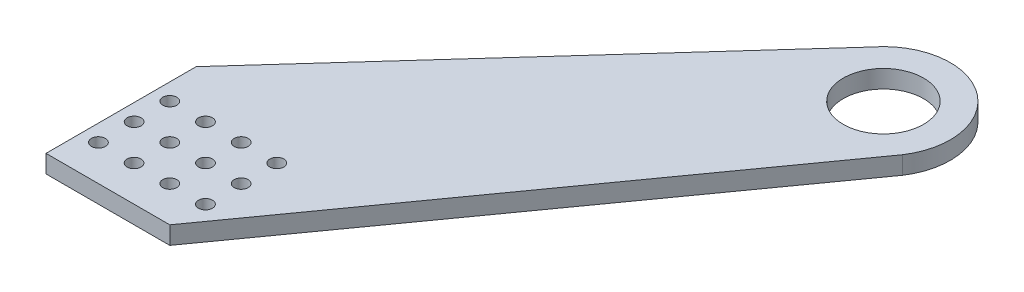
ISO-10303-21;
HEADER;
FILE_DESCRIPTION(('STEP AP214'),'2;1');
FILE_NAME('part.step','',(''),(''),'','','');
FILE_SCHEMA(('AUTOMOTIVE_DESIGN { 1 0 10303 214 1 1 1 1 }'));
ENDSEC;
DATA;
#1=APPLICATION_CONTEXT('core data for automotive mechanical design processes');
#2=APPLICATION_PROTOCOL_DEFINITION('international standard','automotive_design',2000,#1);
#3=PRODUCT_CONTEXT('',#1,'mechanical');
#4=PRODUCT('Part','Part','',(#3));
#5=PRODUCT_RELATED_PRODUCT_CATEGORY('part','',(#4));
#6=PRODUCT_DEFINITION_FORMATION('','',#4);
#7=PRODUCT_DEFINITION_CONTEXT('part definition',#1,'design');
#8=PRODUCT_DEFINITION('design','',#6,#7);
#9=PRODUCT_DEFINITION_SHAPE('','',#8);
#10=(LENGTH_UNIT() NAMED_UNIT(*) SI_UNIT(.MILLI.,.METRE.));
#11=(NAMED_UNIT(*) PLANE_ANGLE_UNIT() SI_UNIT($,.RADIAN.));
#12=(NAMED_UNIT(*) SI_UNIT($,.STERADIAN.) SOLID_ANGLE_UNIT());
#13=UNCERTAINTY_MEASURE_WITH_UNIT(LENGTH_MEASURE(1.E-05),#10,'distance_accuracy_value','');
#14=(GEOMETRIC_REPRESENTATION_CONTEXT(3) GLOBAL_UNCERTAINTY_ASSIGNED_CONTEXT((#13)) GLOBAL_UNIT_ASSIGNED_CONTEXT((#10,
#11,#12)) REPRESENTATION_CONTEXT('',''));
#15=CARTESIAN_POINT('',(0.,0.,0.));
#16=DIRECTION('',(0.,0.,1.));
#17=DIRECTION('',(1.,0.,0.));
#18=AXIS2_PLACEMENT_3D('',#15,#16,#17);
#19=CARTESIAN_POINT('',(-51.2601360500161,6.35,-36.6866869012752));
#20=DIRECTION('',(-0.813190602315479,0.,-0.581997460738265));
#21=DIRECTION('',(-0.581997460738265,0.,0.813190602315479));
#22=AXIS2_PLACEMENT_3D('',#19,#20,#21);
#23=PLANE('',#22);
#24=DIRECTION('',(0.581997460738265,0.,-0.813190602315479));
#25=VECTOR('',#24,1.);
#26=CARTESIAN_POINT('',(-51.2601360500161,0.,-36.6866869012752));
#27=LINE('',#26,#25);
#28=CARTESIAN_POINT('',(590.55,0.,-933.45));
#29=VERTEX_POINT('',#28);
#30=CARTESIAN_POINT('',(699.329134459148,0.,-1085.4406457289));
#31=VERTEX_POINT('',#30);
#32=EDGE_CURVE('E150',#29,#31,#27,.T.);
#33=ORIENTED_EDGE('',*,*,#32,.T.);
#34=DIRECTION('',(0.,-1.,0.));
#35=VECTOR('',#34,1.);
#36=CARTESIAN_POINT('',(699.329134459148,6.35,-1085.4406457289));
#37=LINE('',#36,#35);
#38=CARTESIAN_POINT('',(699.329134459148,6.35,-1085.4406457289));
#39=VERTEX_POINT('',#38);
#40=EDGE_CURVE('E11',#39,#31,#37,.T.);
#41=ORIENTED_EDGE('',*,*,#40,.F.);
#42=DIRECTION('',(0.581997460738265,0.,-0.813190602315479));
#43=VECTOR('',#42,1.);
#44=CARTESIAN_POINT('',(-51.2601360500161,6.35,-36.6866869012752));
#45=LINE('',#44,#43);
#46=CARTESIAN_POINT('',(590.55,6.35,-933.45));
#47=VERTEX_POINT('',#46);
#48=EDGE_CURVE('E105',#47,#39,#45,.T.);
#49=ORIENTED_EDGE('',*,*,#48,.F.);
#50=DIRECTION('',(0.,-1.,0.));
#51=VECTOR('',#50,1.);
#52=CARTESIAN_POINT('',(590.55,6.35,-933.45));
#53=LINE('',#52,#51);
#54=EDGE_CURVE('E110',#47,#29,#53,.T.);
#55=ORIENTED_EDGE('',*,*,#54,.T.);
#56=EDGE_LOOP('',(#33,#41,#49,#55));
#57=FACE_BOUND('',#56,.T.);
#58=ADVANCED_FACE('F35',(#57),#23,.F.);
#59=CARTESIAN_POINT('',(679.45,6.35,-1098.55));
#60=DIRECTION('',(0.,-1.,0.));
#61=DIRECTION('',(0.,0.,-1.));
#62=AXIS2_PLACEMENT_3D('',#59,#60,#61);
#63=CYLINDRICAL_SURFACE('',#62,23.8125);
#64=CARTESIAN_POINT('',(679.45,0.,-1098.55));
#65=DIRECTION('',(0.,1.,0.));
#66=DIRECTION('',(0.,0.,1.));
#67=AXIS2_PLACEMENT_3D('',#64,#65,#66);
#68=CIRCLE('',#67,23.8125);
#69=CARTESIAN_POINT('',(660.629172145986,0.,-1113.1380634472));
#70=VERTEX_POINT('',#69);
#71=EDGE_CURVE('E153',#31,#70,#68,.T.);
#72=ORIENTED_EDGE('',*,*,#71,.T.);
#73=DIRECTION('',(0.,-1.,0.));
#74=VECTOR('',#73,1.);
#75=CARTESIAN_POINT('',(660.629172145986,6.35,-1113.1380634472));
#76=LINE('',#75,#74);
#77=CARTESIAN_POINT('',(660.629172145986,6.35,-1113.1380634472));
#78=VERTEX_POINT('',#77);
#79=EDGE_CURVE('E44',#78,#70,#76,.T.);
#80=ORIENTED_EDGE('',*,*,#79,.F.);
#81=CARTESIAN_POINT('',(679.45,6.35,-1098.55));
#82=DIRECTION('',(0.,1.,0.));
#83=DIRECTION('',(0.,0.,1.));
#84=AXIS2_PLACEMENT_3D('',#81,#82,#83);
#85=CIRCLE('',#84,23.8125);
#86=EDGE_CURVE('E85',#39,#78,#85,.T.);
#87=ORIENTED_EDGE('',*,*,#86,.F.);
#88=ORIENTED_EDGE('',*,*,#40,.T.);
#89=EDGE_LOOP('',(#72,#80,#87,#88));
#90=FACE_BOUND('',#89,.T.);
#91=ADVANCED_FACE('F161',(#90),#63,.T.);
#92=CARTESIAN_POINT('',(-190.254107287016,6.35,-172.010780817744));
#93=DIRECTION('',(-0.741776037995552,0.,-0.670647679080172));
#94=DIRECTION('',(-0.670647679080172,0.,0.741776037995552));
#95=AXIS2_PLACEMENT_3D('',#92,#93,#94);
#96=PLANE('',#95);
#97=DIRECTION('',(0.670647679080172,0.,-0.741776037995552));
#98=VECTOR('',#97,1.);
#99=CARTESIAN_POINT('',(-190.254107287016,0.,-172.010780817744));
#100=LINE('',#99,#98);
#101=CARTESIAN_POINT('',(546.490533987518,0.,-986.893972195713));
#102=VERTEX_POINT('',#101);
#103=EDGE_CURVE('E97',#102,#70,#100,.T.);
#104=ORIENTED_EDGE('',*,*,#103,.F.);
#105=DIRECTION('',(0.,-1.,0.));
#106=VECTOR('',#105,1.);
#107=CARTESIAN_POINT('',(546.490533987518,6.35,-986.893972195713));
#108=LINE('',#107,#106);
#109=CARTESIAN_POINT('',(546.490533987518,6.35,-986.893972195713));
#110=VERTEX_POINT('',#109);
#111=EDGE_CURVE('E91',#110,#102,#108,.T.);
#112=ORIENTED_EDGE('',*,*,#111,.F.);
#113=DIRECTION('',(0.670647679080172,0.,-0.741776037995552));
#114=VECTOR('',#113,1.);
#115=CARTESIAN_POINT('',(-190.254107287016,6.35,-172.010780817744));
#116=LINE('',#115,#114);
#117=EDGE_CURVE('E95',#110,#78,#116,.T.);
#118=ORIENTED_EDGE('',*,*,#117,.T.);
#119=ORIENTED_EDGE('',*,*,#79,.T.);
#120=EDGE_LOOP('',(#104,#112,#118,#119));
#121=FACE_BOUND('',#120,.T.);
#122=ADVANCED_FACE('F93',(#121),#96,.T.);
#123=CARTESIAN_POINT('',(546.49053398752,6.35,-1.13525688425777E-12));
#124=DIRECTION('',(1.,0.,0.));
#125=DIRECTION('',(0.,0.,-1.));
#126=AXIS2_PLACEMENT_3D('',#123,#124,#125);
#127=PLANE('',#126);
#128=DIRECTION('',(0.,0.,1.));
#129=VECTOR('',#128,1.);
#130=CARTESIAN_POINT('',(546.49053398752,0.,-1.13525688425777E-12));
#131=LINE('',#130,#129);
#132=CARTESIAN_POINT('',(546.490533987518,0.,-933.45));
#133=VERTEX_POINT('',#132);
#134=EDGE_CURVE('E71',#102,#133,#131,.T.);
#135=ORIENTED_EDGE('',*,*,#134,.T.);
#136=DIRECTION('',(0.,-1.,0.));
#137=VECTOR('',#136,1.);
#138=CARTESIAN_POINT('',(546.490533987518,6.35,-933.45));
#139=LINE('',#138,#137);
#140=CARTESIAN_POINT('',(546.490533987518,6.35,-933.45));
#141=VERTEX_POINT('',#140);
#142=EDGE_CURVE('E98',#141,#133,#139,.T.);
#143=ORIENTED_EDGE('',*,*,#142,.F.);
#144=DIRECTION('',(0.,0.,1.));
#145=VECTOR('',#144,1.);
#146=CARTESIAN_POINT('',(546.49053398752,6.35,-1.13525688425777E-12));
#147=LINE('',#146,#145);
#148=EDGE_CURVE('E100',#110,#141,#147,.T.);
#149=ORIENTED_EDGE('',*,*,#148,.F.);
#150=ORIENTED_EDGE('',*,*,#111,.T.);
#151=EDGE_LOOP('',(#135,#143,#149,#150));
#152=FACE_BOUND('',#151,.T.);
#153=ADVANCED_FACE('F101',(#152),#127,.F.);
#154=CARTESIAN_POINT('',(679.45,6.35,-1098.55));
#155=DIRECTION('',(0.,-1.,0.));
#156=DIRECTION('',(0.,0.,-1.));
#157=AXIS2_PLACEMENT_3D('',#154,#155,#156);
#158=CYLINDRICAL_SURFACE('',#157,14.2875);
#159=CARTESIAN_POINT('',(679.45,6.35,-1098.55));
#160=DIRECTION('',(0.,1.,0.));
#161=DIRECTION('',(0.,0.,1.));
#162=AXIS2_PLACEMENT_3D('',#159,#160,#161);
#163=CIRCLE('',#162,14.2875);
#164=CARTESIAN_POINT('',(679.45,6.35,-1084.2625));
#165=VERTEX_POINT('',#164);
#166=EDGE_CURVE('E430',#165,#165,#163,.T.);
#167=ORIENTED_EDGE('',*,*,#166,.T.);
#168=EDGE_LOOP('',(#167));
#169=FACE_BOUND('',#168,.T.);
#170=CARTESIAN_POINT('',(679.45,0.,-1098.55));
#171=DIRECTION('',(0.,1.,0.));
#172=DIRECTION('',(0.,0.,1.));
#173=AXIS2_PLACEMENT_3D('',#170,#171,#172);
#174=CIRCLE('',#173,14.2875);
#175=CARTESIAN_POINT('',(679.45,0.,-1084.2625));
#176=VERTEX_POINT('',#175);
#177=EDGE_CURVE('E147',#176,#176,#174,.T.);
#178=ORIENTED_EDGE('',*,*,#177,.F.);
#179=EDGE_LOOP('',(#178));
#180=FACE_BOUND('',#179,.T.);
#181=ADVANCED_FACE('F189',(#169,#180),#158,.F.);
#182=CARTESIAN_POINT('',(590.55,6.35,-971.55));
#183=DIRECTION('',(0.,-1.,0.));
#184=DIRECTION('',(0.,0.,-1.));
#185=AXIS2_PLACEMENT_3D('',#182,#183,#184);
#186=CYLINDRICAL_SURFACE('',#185,2.48919999999994);
#187=CARTESIAN_POINT('',(590.55,6.35,-971.55));
#188=DIRECTION('',(0.,1.,0.));
#189=DIRECTION('',(0.,0.,1.));
#190=AXIS2_PLACEMENT_3D('',#187,#188,#189);
#191=CIRCLE('',#190,2.48919999999994);
#192=CARTESIAN_POINT('',(590.55,6.35,-969.0608));
#193=VERTEX_POINT('',#192);
#194=EDGE_CURVE('E427',#193,#193,#191,.T.);
#195=ORIENTED_EDGE('',*,*,#194,.T.);
#196=EDGE_LOOP('',(#195));
#197=FACE_BOUND('',#196,.T.);
#198=CARTESIAN_POINT('',(590.55,0.,-971.55));
#199=DIRECTION('',(0.,1.,0.));
#200=DIRECTION('',(0.,0.,1.));
#201=AXIS2_PLACEMENT_3D('',#198,#199,#200);
#202=CIRCLE('',#201,2.48919999999994);
#203=CARTESIAN_POINT('',(590.55,0.,-969.0608));
#204=VERTEX_POINT('',#203);
#205=EDGE_CURVE('E144',#204,#204,#202,.T.);
#206=ORIENTED_EDGE('',*,*,#205,.F.);
#207=EDGE_LOOP('',(#206));
#208=FACE_BOUND('',#207,.T.);
#209=ADVANCED_FACE('F192',(#197,#208),#186,.F.);
#210=CARTESIAN_POINT('',(577.85,6.35,-971.55));
#211=DIRECTION('',(0.,-1.,0.));
#212=DIRECTION('',(0.,0.,-1.));
#213=AXIS2_PLACEMENT_3D('',#210,#211,#212);
#214=CYLINDRICAL_SURFACE('',#213,2.48919999999994);
#215=CARTESIAN_POINT('',(577.85,6.35,-971.55));
#216=DIRECTION('',(0.,1.,0.));
#217=DIRECTION('',(0.,0.,1.));
#218=AXIS2_PLACEMENT_3D('',#215,#216,#217);
#219=CIRCLE('',#218,2.48919999999994);
#220=CARTESIAN_POINT('',(577.85,6.35,-969.0608));
#221=VERTEX_POINT('',#220);
#222=EDGE_CURVE('E424',#221,#221,#219,.T.);
#223=ORIENTED_EDGE('',*,*,#222,.T.);
#224=EDGE_LOOP('',(#223));
#225=FACE_BOUND('',#224,.T.);
#226=CARTESIAN_POINT('',(577.85,0.,-971.55));
#227=DIRECTION('',(0.,1.,0.));
#228=DIRECTION('',(0.,0.,1.));
#229=AXIS2_PLACEMENT_3D('',#226,#227,#228);
#230=CIRCLE('',#229,2.48919999999994);
#231=CARTESIAN_POINT('',(577.85,0.,-969.0608));
#232=VERTEX_POINT('',#231);
#233=EDGE_CURVE('E141',#232,#232,#230,.T.);
#234=ORIENTED_EDGE('',*,*,#233,.F.);
#235=EDGE_LOOP('',(#234));
#236=FACE_BOUND('',#235,.T.);
#237=ADVANCED_FACE('F196',(#225,#236),#214,.F.);
#238=CARTESIAN_POINT('',(577.85,6.35,-958.85));
#239=DIRECTION('',(0.,-1.,0.));
#240=DIRECTION('',(0.,0.,-1.));
#241=AXIS2_PLACEMENT_3D('',#238,#239,#240);
#242=CYLINDRICAL_SURFACE('',#241,2.48919999999994);
#243=CARTESIAN_POINT('',(577.85,6.35,-958.85));
#244=DIRECTION('',(0.,1.,0.));
#245=DIRECTION('',(0.,0.,1.));
#246=AXIS2_PLACEMENT_3D('',#243,#244,#245);
#247=CIRCLE('',#246,2.48919999999994);
#248=CARTESIAN_POINT('',(577.85,6.35,-956.3608));
#249=VERTEX_POINT('',#248);
#250=EDGE_CURVE('E421',#249,#249,#247,.T.);
#251=ORIENTED_EDGE('',*,*,#250,.T.);
#252=EDGE_LOOP('',(#251));
#253=FACE_BOUND('',#252,.T.);
#254=CARTESIAN_POINT('',(577.85,0.,-958.85));
#255=DIRECTION('',(0.,1.,0.));
#256=DIRECTION('',(0.,0.,1.));
#257=AXIS2_PLACEMENT_3D('',#254,#255,#256);
#258=CIRCLE('',#257,2.48919999999994);
#259=CARTESIAN_POINT('',(577.85,0.,-956.3608));
#260=VERTEX_POINT('',#259);
#261=EDGE_CURVE('E138',#260,#260,#258,.T.);
#262=ORIENTED_EDGE('',*,*,#261,.F.);
#263=EDGE_LOOP('',(#262));
#264=FACE_BOUND('',#263,.T.);
#265=ADVANCED_FACE('F200',(#253,#264),#242,.F.);
#266=CARTESIAN_POINT('',(590.55,6.35,-958.85));
#267=DIRECTION('',(0.,-1.,0.));
#268=DIRECTION('',(0.,0.,-1.));
#269=AXIS2_PLACEMENT_3D('',#266,#267,#268);
#270=CYLINDRICAL_SURFACE('',#269,2.48919999999994);
#271=CARTESIAN_POINT('',(590.55,6.35,-958.85));
#272=DIRECTION('',(0.,1.,0.));
#273=DIRECTION('',(0.,0.,1.));
#274=AXIS2_PLACEMENT_3D('',#271,#272,#273);
#275=CIRCLE('',#274,2.48919999999994);
#276=CARTESIAN_POINT('',(590.55,6.35,-956.3608));
#277=VERTEX_POINT('',#276);
#278=EDGE_CURVE('E418',#277,#277,#275,.T.);
#279=ORIENTED_EDGE('',*,*,#278,.T.);
#280=EDGE_LOOP('',(#279));
#281=FACE_BOUND('',#280,.T.);
#282=CARTESIAN_POINT('',(590.55,0.,-958.85));
#283=DIRECTION('',(0.,1.,0.));
#284=DIRECTION('',(0.,0.,1.));
#285=AXIS2_PLACEMENT_3D('',#282,#283,#284);
#286=CIRCLE('',#285,2.48919999999994);
#287=CARTESIAN_POINT('',(590.55,0.,-956.3608));
#288=VERTEX_POINT('',#287);
#289=EDGE_CURVE('E135',#288,#288,#286,.T.);
#290=ORIENTED_EDGE('',*,*,#289,.F.);
#291=EDGE_LOOP('',(#290));
#292=FACE_BOUND('',#291,.T.);
#293=ADVANCED_FACE('F204',(#281,#292),#270,.F.);
#294=CARTESIAN_POINT('',(590.55,6.35,-946.15));
#295=DIRECTION('',(0.,-1.,0.));
#296=DIRECTION('',(0.,0.,-1.));
#297=AXIS2_PLACEMENT_3D('',#294,#295,#296);
#298=CYLINDRICAL_SURFACE('',#297,2.48919999999994);
#299=CARTESIAN_POINT('',(590.55,6.35,-946.15));
#300=DIRECTION('',(0.,1.,0.));
#301=DIRECTION('',(0.,0.,1.));
#302=AXIS2_PLACEMENT_3D('',#299,#300,#301);
#303=CIRCLE('',#302,2.48919999999994);
#304=CARTESIAN_POINT('',(590.55,6.35,-943.6608));
#305=VERTEX_POINT('',#304);
#306=EDGE_CURVE('E415',#305,#305,#303,.T.);
#307=ORIENTED_EDGE('',*,*,#306,.T.);
#308=EDGE_LOOP('',(#307));
#309=FACE_BOUND('',#308,.T.);
#310=CARTESIAN_POINT('',(590.55,0.,-946.15));
#311=DIRECTION('',(0.,1.,0.));
#312=DIRECTION('',(0.,0.,1.));
#313=AXIS2_PLACEMENT_3D('',#310,#311,#312);
#314=CIRCLE('',#313,2.48919999999994);
#315=CARTESIAN_POINT('',(590.55,0.,-943.6608));
#316=VERTEX_POINT('',#315);
#317=EDGE_CURVE('E132',#316,#316,#314,.T.);
#318=ORIENTED_EDGE('',*,*,#317,.F.);
#319=EDGE_LOOP('',(#318));
#320=FACE_BOUND('',#319,.T.);
#321=ADVANCED_FACE('F208',(#309,#320),#298,.F.);
#322=CARTESIAN_POINT('',(577.85,6.35,-946.15));
#323=DIRECTION('',(0.,-1.,0.));
#324=DIRECTION('',(0.,0.,-1.));
#325=AXIS2_PLACEMENT_3D('',#322,#323,#324);
#326=CYLINDRICAL_SURFACE('',#325,2.48919999999994);
#327=CARTESIAN_POINT('',(577.85,6.35,-946.15));
#328=DIRECTION('',(0.,1.,0.));
#329=DIRECTION('',(0.,0.,1.));
#330=AXIS2_PLACEMENT_3D('',#327,#328,#329);
#331=CIRCLE('',#330,2.48919999999994);
#332=CARTESIAN_POINT('',(577.85,6.35,-943.6608));
#333=VERTEX_POINT('',#332);
#334=EDGE_CURVE('E412',#333,#333,#331,.T.);
#335=ORIENTED_EDGE('',*,*,#334,.T.);
#336=EDGE_LOOP('',(#335));
#337=FACE_BOUND('',#336,.T.);
#338=CARTESIAN_POINT('',(577.85,0.,-946.15));
#339=DIRECTION('',(0.,1.,0.));
#340=DIRECTION('',(0.,0.,1.));
#341=AXIS2_PLACEMENT_3D('',#338,#339,#340);
#342=CIRCLE('',#341,2.48919999999994);
#343=CARTESIAN_POINT('',(577.85,0.,-943.6608));
#344=VERTEX_POINT('',#343);
#345=EDGE_CURVE('E129',#344,#344,#342,.T.);
#346=ORIENTED_EDGE('',*,*,#345,.F.);
#347=EDGE_LOOP('',(#346));
#348=FACE_BOUND('',#347,.T.);
#349=ADVANCED_FACE('F212',(#337,#348),#326,.F.);
#350=CARTESIAN_POINT('',(565.15,6.35,-946.15));
#351=DIRECTION('',(0.,-1.,0.));
#352=DIRECTION('',(0.,0.,-1.));
#353=AXIS2_PLACEMENT_3D('',#350,#351,#352);
#354=CYLINDRICAL_SURFACE('',#353,2.48919999999994);
#355=CARTESIAN_POINT('',(565.15,6.35,-946.15));
#356=DIRECTION('',(0.,1.,0.));
#357=DIRECTION('',(0.,0.,1.));
#358=AXIS2_PLACEMENT_3D('',#355,#356,#357);
#359=CIRCLE('',#358,2.48919999999994);
#360=CARTESIAN_POINT('',(565.15,6.35,-943.6608));
#361=VERTEX_POINT('',#360);
#362=EDGE_CURVE('E409',#361,#361,#359,.T.);
#363=ORIENTED_EDGE('',*,*,#362,.T.);
#364=EDGE_LOOP('',(#363));
#365=FACE_BOUND('',#364,.T.);
#366=CARTESIAN_POINT('',(565.15,0.,-946.15));
#367=DIRECTION('',(0.,1.,0.));
#368=DIRECTION('',(0.,0.,1.));
#369=AXIS2_PLACEMENT_3D('',#366,#367,#368);
#370=CIRCLE('',#369,2.48919999999994);
#371=CARTESIAN_POINT('',(565.15,0.,-943.6608));
#372=VERTEX_POINT('',#371);
#373=EDGE_CURVE('E126',#372,#372,#370,.T.);
#374=ORIENTED_EDGE('',*,*,#373,.F.);
#375=EDGE_LOOP('',(#374));
#376=FACE_BOUND('',#375,.T.);
#377=ADVANCED_FACE('F216',(#365,#376),#354,.F.);
#378=CARTESIAN_POINT('',(565.15,6.35,-958.85));
#379=DIRECTION('',(0.,-1.,0.));
#380=DIRECTION('',(0.,0.,-1.));
#381=AXIS2_PLACEMENT_3D('',#378,#379,#380);
#382=CYLINDRICAL_SURFACE('',#381,2.48919999999994);
#383=CARTESIAN_POINT('',(565.15,6.35,-958.85));
#384=DIRECTION('',(0.,1.,0.));
#385=DIRECTION('',(0.,0.,1.));
#386=AXIS2_PLACEMENT_3D('',#383,#384,#385);
#387=CIRCLE('',#386,2.48919999999994);
#388=CARTESIAN_POINT('',(565.15,6.35,-956.3608));
#389=VERTEX_POINT('',#388);
#390=EDGE_CURVE('E406',#389,#389,#387,.T.);
#391=ORIENTED_EDGE('',*,*,#390,.T.);
#392=EDGE_LOOP('',(#391));
#393=FACE_BOUND('',#392,.T.);
#394=CARTESIAN_POINT('',(565.15,0.,-958.85));
#395=DIRECTION('',(0.,1.,0.));
#396=DIRECTION('',(0.,0.,1.));
#397=AXIS2_PLACEMENT_3D('',#394,#395,#396);
#398=CIRCLE('',#397,2.48919999999994);
#399=CARTESIAN_POINT('',(565.15,0.,-956.3608));
#400=VERTEX_POINT('',#399);
#401=EDGE_CURVE('E123',#400,#400,#398,.T.);
#402=ORIENTED_EDGE('',*,*,#401,.F.);
#403=EDGE_LOOP('',(#402));
#404=FACE_BOUND('',#403,.T.);
#405=ADVANCED_FACE('F220',(#393,#404),#382,.F.);
#406=CARTESIAN_POINT('',(565.15,6.35,-971.55));
#407=DIRECTION('',(0.,-1.,0.));
#408=DIRECTION('',(0.,0.,-1.));
#409=AXIS2_PLACEMENT_3D('',#406,#407,#408);
#410=CYLINDRICAL_SURFACE('',#409,2.48919999999994);
#411=CARTESIAN_POINT('',(565.15,6.35,-971.55));
#412=DIRECTION('',(0.,1.,0.));
#413=DIRECTION('',(0.,0.,1.));
#414=AXIS2_PLACEMENT_3D('',#411,#412,#413);
#415=CIRCLE('',#414,2.48919999999994);
#416=CARTESIAN_POINT('',(565.15,6.35,-969.0608));
#417=VERTEX_POINT('',#416);
#418=EDGE_CURVE('E399',#417,#417,#415,.T.);
#419=ORIENTED_EDGE('',*,*,#418,.T.);
#420=EDGE_LOOP('',(#419));
#421=FACE_BOUND('',#420,.T.);
#422=CARTESIAN_POINT('',(565.15,0.,-971.55));
#423=DIRECTION('',(0.,1.,0.));
#424=DIRECTION('',(0.,0.,1.));
#425=AXIS2_PLACEMENT_3D('',#422,#423,#424);
#426=CIRCLE('',#425,2.48919999999994);
#427=CARTESIAN_POINT('',(565.15,0.,-969.0608));
#428=VERTEX_POINT('',#427);
#429=EDGE_CURVE('E120',#428,#428,#426,.T.);
#430=ORIENTED_EDGE('',*,*,#429,.F.);
#431=EDGE_LOOP('',(#430));
#432=FACE_BOUND('',#431,.T.);
#433=ADVANCED_FACE('F224',(#421,#432),#410,.F.);
#434=CARTESIAN_POINT('',(552.45,6.35,-971.55));
#435=DIRECTION('',(0.,-1.,0.));
#436=DIRECTION('',(0.,0.,-1.));
#437=AXIS2_PLACEMENT_3D('',#434,#435,#436);
#438=CYLINDRICAL_SURFACE('',#437,2.48919999999994);
#439=CARTESIAN_POINT('',(552.45,6.35,-971.55));
#440=DIRECTION('',(0.,1.,0.));
#441=DIRECTION('',(0.,0.,1.));
#442=AXIS2_PLACEMENT_3D('',#439,#440,#441);
#443=CIRCLE('',#442,2.48919999999994);
#444=CARTESIAN_POINT('',(552.45,6.35,-969.0608));
#445=VERTEX_POINT('',#444);
#446=EDGE_CURVE('E396',#445,#445,#443,.T.);
#447=ORIENTED_EDGE('',*,*,#446,.T.);
#448=EDGE_LOOP('',(#447));
#449=FACE_BOUND('',#448,.T.);
#450=CARTESIAN_POINT('',(552.45,0.,-971.55));
#451=DIRECTION('',(0.,1.,0.));
#452=DIRECTION('',(0.,0.,1.));
#453=AXIS2_PLACEMENT_3D('',#450,#451,#452);
#454=CIRCLE('',#453,2.48919999999994);
#455=CARTESIAN_POINT('',(552.45,0.,-969.0608));
#456=VERTEX_POINT('',#455);
#457=EDGE_CURVE('E117',#456,#456,#454,.T.);
#458=ORIENTED_EDGE('',*,*,#457,.F.);
#459=EDGE_LOOP('',(#458));
#460=FACE_BOUND('',#459,.T.);
#461=ADVANCED_FACE('F228',(#449,#460),#438,.F.);
#462=CARTESIAN_POINT('',(552.45,6.35,-958.85));
#463=DIRECTION('',(0.,-1.,0.));
#464=DIRECTION('',(0.,0.,-1.));
#465=AXIS2_PLACEMENT_3D('',#462,#463,#464);
#466=CYLINDRICAL_SURFACE('',#465,2.48919999999994);
#467=CARTESIAN_POINT('',(552.45,6.35,-958.85));
#468=DIRECTION('',(0.,1.,0.));
#469=DIRECTION('',(0.,0.,1.));
#470=AXIS2_PLACEMENT_3D('',#467,#468,#469);
#471=CIRCLE('',#470,2.48919999999994);
#472=CARTESIAN_POINT('',(552.45,6.35,-956.3608));
#473=VERTEX_POINT('',#472);
#474=EDGE_CURVE('E239',#473,#473,#471,.T.);
#475=ORIENTED_EDGE('',*,*,#474,.T.);
#476=EDGE_LOOP('',(#475));
#477=FACE_BOUND('',#476,.T.);
#478=CARTESIAN_POINT('',(552.45,0.,-958.85));
#479=DIRECTION('',(0.,1.,0.));
#480=DIRECTION('',(0.,0.,1.));
#481=AXIS2_PLACEMENT_3D('',#478,#479,#480);
#482=CIRCLE('',#481,2.48919999999994);
#483=CARTESIAN_POINT('',(552.45,0.,-956.3608));
#484=VERTEX_POINT('',#483);
#485=EDGE_CURVE('E114',#484,#484,#482,.T.);
#486=ORIENTED_EDGE('',*,*,#485,.F.);
#487=EDGE_LOOP('',(#486));
#488=FACE_BOUND('',#487,.T.);
#489=ADVANCED_FACE('F177',(#477,#488),#466,.F.);
#490=CARTESIAN_POINT('',(552.45,6.35,-946.15));
#491=DIRECTION('',(0.,-1.,0.));
#492=DIRECTION('',(0.,0.,-1.));
#493=AXIS2_PLACEMENT_3D('',#490,#491,#492);
#494=CYLINDRICAL_SURFACE('',#493,2.48919999999994);
#495=CARTESIAN_POINT('',(552.45,6.35,-946.15));
#496=DIRECTION('',(0.,1.,0.));
#497=DIRECTION('',(0.,0.,1.));
#498=AXIS2_PLACEMENT_3D('',#495,#496,#497);
#499=CIRCLE('',#498,2.48919999999994);
#500=CARTESIAN_POINT('',(552.45,6.35,-943.6608));
#501=VERTEX_POINT('',#500);
#502=EDGE_CURVE('E159',#501,#501,#499,.T.);
#503=ORIENTED_EDGE('',*,*,#502,.T.);
#504=EDGE_LOOP('',(#503));
#505=FACE_BOUND('',#504,.T.);
#506=CARTESIAN_POINT('',(552.45,0.,-946.15));
#507=DIRECTION('',(0.,1.,0.));
#508=DIRECTION('',(0.,0.,1.));
#509=AXIS2_PLACEMENT_3D('',#506,#507,#508);
#510=CIRCLE('',#509,2.48919999999994);
#511=CARTESIAN_POINT('',(552.45,0.,-943.6608));
#512=VERTEX_POINT('',#511);
#513=EDGE_CURVE('E111',#512,#512,#510,.T.);
#514=ORIENTED_EDGE('',*,*,#513,.F.);
#515=EDGE_LOOP('',(#514));
#516=FACE_BOUND('',#515,.T.);
#517=ADVANCED_FACE('F37',(#505,#516),#494,.F.);
#518=CARTESIAN_POINT('',(0.,6.35,-933.45));
#519=DIRECTION('',(0.,0.,-1.));
#520=DIRECTION('',(-1.,0.,0.));
#521=AXIS2_PLACEMENT_3D('',#518,#519,#520);
#522=PLANE('',#521);
#523=DIRECTION('',(1.,0.,0.));
#524=VECTOR('',#523,1.);
#525=CARTESIAN_POINT('',(0.,0.,-933.45));
#526=LINE('',#525,#524);
#527=EDGE_CURVE('E77',#133,#29,#526,.T.);
#528=ORIENTED_EDGE('',*,*,#527,.T.);
#529=ORIENTED_EDGE('',*,*,#54,.F.);
#530=DIRECTION('',(1.,0.,0.));
#531=VECTOR('',#530,1.);
#532=CARTESIAN_POINT('',(0.,6.35,-933.45));
#533=LINE('',#532,#531);
#534=EDGE_CURVE('E52',#141,#47,#533,.T.);
#535=ORIENTED_EDGE('',*,*,#534,.F.);
#536=ORIENTED_EDGE('',*,*,#142,.T.);
#537=EDGE_LOOP('',(#528,#529,#535,#536));
#538=FACE_BOUND('',#537,.T.);
#539=ADVANCED_FACE('F168',(#538),#522,.F.);
#540=CARTESIAN_POINT('',(0.,6.35,0.));
#541=DIRECTION('',(0.,1.,0.));
#542=DIRECTION('',(0.,0.,1.));
#543=AXIS2_PLACEMENT_3D('',#540,#541,#542);
#544=PLANE('',#543);
#545=ORIENTED_EDGE('',*,*,#502,.F.);
#546=EDGE_LOOP('',(#545));
#547=FACE_BOUND('',#546,.T.);
#548=ORIENTED_EDGE('',*,*,#474,.F.);
#549=EDGE_LOOP('',(#548));
#550=FACE_BOUND('',#549,.T.);
#551=ORIENTED_EDGE('',*,*,#446,.F.);
#552=EDGE_LOOP('',(#551));
#553=FACE_BOUND('',#552,.T.);
#554=ORIENTED_EDGE('',*,*,#418,.F.);
#555=EDGE_LOOP('',(#554));
#556=FACE_BOUND('',#555,.T.);
#557=ORIENTED_EDGE('',*,*,#390,.F.);
#558=EDGE_LOOP('',(#557));
#559=FACE_BOUND('',#558,.T.);
#560=ORIENTED_EDGE('',*,*,#362,.F.);
#561=EDGE_LOOP('',(#560));
#562=FACE_BOUND('',#561,.T.);
#563=ORIENTED_EDGE('',*,*,#334,.F.);
#564=EDGE_LOOP('',(#563));
#565=FACE_BOUND('',#564,.T.);
#566=ORIENTED_EDGE('',*,*,#306,.F.);
#567=EDGE_LOOP('',(#566));
#568=FACE_BOUND('',#567,.T.);
#569=ORIENTED_EDGE('',*,*,#278,.F.);
#570=EDGE_LOOP('',(#569));
#571=FACE_BOUND('',#570,.T.);
#572=ORIENTED_EDGE('',*,*,#250,.F.);
#573=EDGE_LOOP('',(#572));
#574=FACE_BOUND('',#573,.T.);
#575=ORIENTED_EDGE('',*,*,#222,.F.);
#576=EDGE_LOOP('',(#575));
#577=FACE_BOUND('',#576,.T.);
#578=ORIENTED_EDGE('',*,*,#194,.F.);
#579=EDGE_LOOP('',(#578));
#580=FACE_BOUND('',#579,.T.);
#581=ORIENTED_EDGE('',*,*,#166,.F.);
#582=EDGE_LOOP('',(#581));
#583=FACE_BOUND('',#582,.T.);
#584=ORIENTED_EDGE('',*,*,#48,.T.);
#585=ORIENTED_EDGE('',*,*,#86,.T.);
#586=ORIENTED_EDGE('',*,*,#117,.F.);
#587=ORIENTED_EDGE('',*,*,#148,.T.);
#588=ORIENTED_EDGE('',*,*,#534,.T.);
#589=EDGE_LOOP('',(#584,#585,#586,#587,#588));
#590=FACE_BOUND('',#589,.T.);
#591=ADVANCED_FACE('F103',(#547,#550,#553,#556,#559,#562,#565,#568,#571,#574,#577,#580,#583,
#590),#544,.T.);
#592=CARTESIAN_POINT('',(0.,0.,0.));
#593=DIRECTION('',(0.,1.,0.));
#594=DIRECTION('',(0.,0.,1.));
#595=AXIS2_PLACEMENT_3D('',#592,#593,#594);
#596=PLANE('',#595);
#597=ORIENTED_EDGE('',*,*,#513,.T.);
#598=EDGE_LOOP('',(#597));
#599=FACE_BOUND('',#598,.T.);
#600=ORIENTED_EDGE('',*,*,#485,.T.);
#601=EDGE_LOOP('',(#600));
#602=FACE_BOUND('',#601,.T.);
#603=ORIENTED_EDGE('',*,*,#457,.T.);
#604=EDGE_LOOP('',(#603));
#605=FACE_BOUND('',#604,.T.);
#606=ORIENTED_EDGE('',*,*,#429,.T.);
#607=EDGE_LOOP('',(#606));
#608=FACE_BOUND('',#607,.T.);
#609=ORIENTED_EDGE('',*,*,#401,.T.);
#610=EDGE_LOOP('',(#609));
#611=FACE_BOUND('',#610,.T.);
#612=ORIENTED_EDGE('',*,*,#373,.T.);
#613=EDGE_LOOP('',(#612));
#614=FACE_BOUND('',#613,.T.);
#615=ORIENTED_EDGE('',*,*,#345,.T.);
#616=EDGE_LOOP('',(#615));
#617=FACE_BOUND('',#616,.T.);
#618=ORIENTED_EDGE('',*,*,#317,.T.);
#619=EDGE_LOOP('',(#618));
#620=FACE_BOUND('',#619,.T.);
#621=ORIENTED_EDGE('',*,*,#289,.T.);
#622=EDGE_LOOP('',(#621));
#623=FACE_BOUND('',#622,.T.);
#624=ORIENTED_EDGE('',*,*,#261,.T.);
#625=EDGE_LOOP('',(#624));
#626=FACE_BOUND('',#625,.T.);
#627=ORIENTED_EDGE('',*,*,#233,.T.);
#628=EDGE_LOOP('',(#627));
#629=FACE_BOUND('',#628,.T.);
#630=ORIENTED_EDGE('',*,*,#205,.T.);
#631=EDGE_LOOP('',(#630));
#632=FACE_BOUND('',#631,.T.);
#633=ORIENTED_EDGE('',*,*,#177,.T.);
#634=EDGE_LOOP('',(#633));
#635=FACE_BOUND('',#634,.T.);
#636=ORIENTED_EDGE('',*,*,#32,.F.);
#637=ORIENTED_EDGE('',*,*,#527,.F.);
#638=ORIENTED_EDGE('',*,*,#134,.F.);
#639=ORIENTED_EDGE('',*,*,#103,.T.);
#640=ORIENTED_EDGE('',*,*,#71,.F.);
#641=EDGE_LOOP('',(#636,#637,#638,#639,#640));
#642=FACE_BOUND('',#641,.T.);
#643=ADVANCED_FACE('F165',(#599,#602,#605,#608,#611,#614,#617,#620,#623,#626,#629,#632,#635,
#642),#596,.F.);
#644=CLOSED_SHELL('',(#58,#91,#122,#153,#181,#209,#237,#265,#293,#321,#349,#377,#405,#433,#461,
#489,#517,#539,#591,#643));
#645=MANIFOLD_SOLID_BREP('B2',#644);
#646=ADVANCED_BREP_SHAPE_REPRESENTATION('',(#18,#645),#14);
#647=SHAPE_DEFINITION_REPRESENTATION(#9,#646);
ENDSEC;
END-ISO-10303-21;
